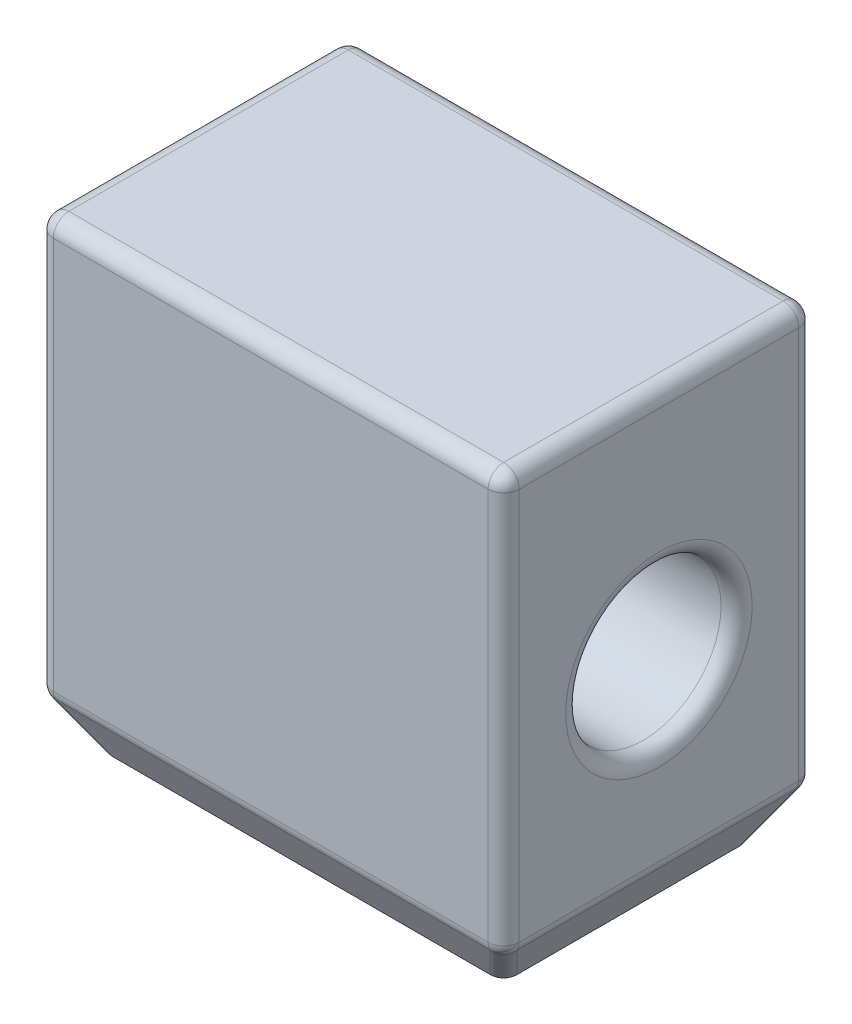
ISO-10303-21;
HEADER;
FILE_DESCRIPTION(('STEP AP214'),'2;1');
FILE_NAME('part.step','',(''),(''),'','','');
FILE_SCHEMA(('AUTOMOTIVE_DESIGN { 1 0 10303 214 1 1 1 1 }'));
ENDSEC;
DATA;
#1=APPLICATION_CONTEXT('core data for automotive mechanical design processes');
#2=APPLICATION_PROTOCOL_DEFINITION('international standard','automotive_design',2000,#1);
#3=PRODUCT_CONTEXT('',#1,'mechanical');
#4=PRODUCT('Part','Part','',(#3));
#5=PRODUCT_RELATED_PRODUCT_CATEGORY('part','',(#4));
#6=PRODUCT_DEFINITION_FORMATION('','',#4);
#7=PRODUCT_DEFINITION_CONTEXT('part definition',#1,'design');
#8=PRODUCT_DEFINITION('design','',#6,#7);
#9=PRODUCT_DEFINITION_SHAPE('','',#8);
#10=(LENGTH_UNIT() NAMED_UNIT(*) SI_UNIT(.MILLI.,.METRE.));
#11=(NAMED_UNIT(*) PLANE_ANGLE_UNIT() SI_UNIT($,.RADIAN.));
#12=(NAMED_UNIT(*) SI_UNIT($,.STERADIAN.) SOLID_ANGLE_UNIT());
#13=UNCERTAINTY_MEASURE_WITH_UNIT(LENGTH_MEASURE(1.E-05),#10,'distance_accuracy_value','');
#14=(GEOMETRIC_REPRESENTATION_CONTEXT(3) GLOBAL_UNCERTAINTY_ASSIGNED_CONTEXT((#13)) GLOBAL_UNIT_ASSIGNED_CONTEXT((#10,
#11,#12)) REPRESENTATION_CONTEXT('',''));
#15=CARTESIAN_POINT('',(0.,0.,0.));
#16=DIRECTION('',(0.,0.,1.));
#17=DIRECTION('',(1.,0.,0.));
#18=AXIS2_PLACEMENT_3D('',#15,#16,#17);
#19=CARTESIAN_POINT('',(150.,150.,-100.));
#20=DIRECTION('',(-1.,0.,0.));
#21=DIRECTION('',(0.,0.,1.));
#22=AXIS2_PLACEMENT_3D('',#19,#20,#21);
#23=PLANE('',#22);
#24=CARTESIAN_POINT('',(150.,75.,-50.));
#25=DIRECTION('',(-1.,0.,0.));
#26=DIRECTION('',(0.,0.,1.));
#27=AXIS2_PLACEMENT_3D('',#24,#25,#26);
#28=CIRCLE('',#27,30.);
#29=CARTESIAN_POINT('',(150.,75.,-20.));
#30=VERTEX_POINT('',#29);
#31=EDGE_CURVE('E237',#30,#30,#28,.T.);
#32=ORIENTED_EDGE('',*,*,#31,.T.);
#33=EDGE_LOOP('',(#32));
#34=FACE_BOUND('',#33,.T.);
#35=DIRECTION('',(0.,0.,1.));
#36=VECTOR('',#35,1.);
#37=CARTESIAN_POINT('',(150.,18.6602540378444,-100.));
#38=LINE('',#37,#36);
#39=CARTESIAN_POINT('',(150.,18.6602540378444,-5.));
#40=VERTEX_POINT('',#39);
#41=CARTESIAN_POINT('',(150.,18.6602540378444,-95.));
#42=VERTEX_POINT('',#41);
#43=EDGE_CURVE('E243',#40,#42,#38,.F.);
#44=ORIENTED_EDGE('',*,*,#43,.T.);
#45=DIRECTION('',(0.,-1.,0.));
#46=VECTOR('',#45,1.);
#47=CARTESIAN_POINT('',(150.,150.,-95.));
#48=LINE('',#47,#46);
#49=CARTESIAN_POINT('',(150.,145.,-95.));
#50=VERTEX_POINT('',#49);
#51=EDGE_CURVE('E246',#42,#50,#48,.F.);
#52=ORIENTED_EDGE('',*,*,#51,.T.);
#53=DIRECTION('',(0.,0.,-1.));
#54=VECTOR('',#53,1.);
#55=CARTESIAN_POINT('',(150.,145.,0.));
#56=LINE('',#55,#54);
#57=CARTESIAN_POINT('',(150.,145.,-5.00000000000001));
#58=VERTEX_POINT('',#57);
#59=EDGE_CURVE('E368',#50,#58,#56,.F.);
#60=ORIENTED_EDGE('',*,*,#59,.T.);
#61=DIRECTION('',(0.,-1.,0.));
#62=VECTOR('',#61,1.);
#63=CARTESIAN_POINT('',(150.,150.,-5.));
#64=LINE('',#63,#62);
#65=EDGE_CURVE('E240',#58,#40,#64,.T.);
#66=ORIENTED_EDGE('',*,*,#65,.T.);
#67=EDGE_LOOP('',(#44,#52,#60,#66));
#68=FACE_BOUND('',#67,.T.);
#69=ADVANCED_FACE('F41',(#34,#68),#23,.F.);
#70=CARTESIAN_POINT('',(0.,150.,-100.));
#71=DIRECTION('',(0.,0.,1.));
#72=DIRECTION('',(1.,0.,0.));
#73=AXIS2_PLACEMENT_3D('',#70,#71,#72);
#74=PLANE('',#73);
#75=DIRECTION('',(0.,-1.,0.));
#76=VECTOR('',#75,1.);
#77=CARTESIAN_POINT('',(145.,150.,-100.));
#78=LINE('',#77,#76);
#79=CARTESIAN_POINT('',(145.,145.,-100.));
#80=VERTEX_POINT('',#79);
#81=CARTESIAN_POINT('',(145.,18.6602540378444,-100.));
#82=VERTEX_POINT('',#81);
#83=EDGE_CURVE('E385',#80,#82,#78,.T.);
#84=ORIENTED_EDGE('',*,*,#83,.T.);
#85=DIRECTION('',(1.,0.,0.));
#86=VECTOR('',#85,1.);
#87=CARTESIAN_POINT('',(4.99999999999999,18.6602540378444,-100.));
#88=LINE('',#87,#86);
#89=CARTESIAN_POINT('',(4.99999999999999,18.6602540378444,-100.));
#90=VERTEX_POINT('',#89);
#91=EDGE_CURVE('E285',#82,#90,#88,.F.);
#92=ORIENTED_EDGE('',*,*,#91,.T.);
#93=DIRECTION('',(0.,-1.,0.));
#94=VECTOR('',#93,1.);
#95=CARTESIAN_POINT('',(4.99999999999999,150.,-100.));
#96=LINE('',#95,#94);
#97=CARTESIAN_POINT('',(4.99999999999999,145.,-100.));
#98=VERTEX_POINT('',#97);
#99=EDGE_CURVE('E204',#90,#98,#96,.F.);
#100=ORIENTED_EDGE('',*,*,#99,.T.);
#101=DIRECTION('',(-1.,0.,0.));
#102=VECTOR('',#101,1.);
#103=CARTESIAN_POINT('',(145.,145.,-100.));
#104=LINE('',#103,#102);
#105=EDGE_CURVE('E208',#98,#80,#104,.F.);
#106=ORIENTED_EDGE('',*,*,#105,.T.);
#107=EDGE_LOOP('',(#84,#92,#100,#106));
#108=FACE_BOUND('',#107,.T.);
#109=ADVANCED_FACE('F390',(#108),#74,.F.);
#110=CARTESIAN_POINT('',(0.,150.,-100.));
#111=DIRECTION('',(1.,0.,0.));
#112=DIRECTION('',(0.,0.,-1.));
#113=AXIS2_PLACEMENT_3D('',#110,#111,#112);
#114=PLANE('',#113);
#115=CARTESIAN_POINT('',(0.,75.,-50.));
#116=DIRECTION('',(1.,0.,0.));
#117=DIRECTION('',(0.,0.,-1.));
#118=AXIS2_PLACEMENT_3D('',#115,#116,#117);
#119=CIRCLE('',#118,30.);
#120=CARTESIAN_POINT('',(0.,75.,-80.));
#121=VERTEX_POINT('',#120);
#122=EDGE_CURVE('E217',#121,#121,#119,.T.);
#123=ORIENTED_EDGE('',*,*,#122,.T.);
#124=EDGE_LOOP('',(#123));
#125=FACE_BOUND('',#124,.T.);
#126=DIRECTION('',(0.,0.,-1.));
#127=VECTOR('',#126,1.);
#128=CARTESIAN_POINT('',(0.,18.6602540378444,0.));
#129=LINE('',#128,#127);
#130=CARTESIAN_POINT('',(0.,18.6602540378444,-95.));
#131=VERTEX_POINT('',#130);
#132=CARTESIAN_POINT('',(0.,18.6602540378444,-5.));
#133=VERTEX_POINT('',#132);
#134=EDGE_CURVE('E223',#131,#133,#129,.F.);
#135=ORIENTED_EDGE('',*,*,#134,.T.);
#136=DIRECTION('',(0.,-1.,0.));
#137=VECTOR('',#136,1.);
#138=CARTESIAN_POINT('',(0.,150.,-5.));
#139=LINE('',#138,#137);
#140=CARTESIAN_POINT('',(0.,145.,-5.));
#141=VERTEX_POINT('',#140);
#142=EDGE_CURVE('E226',#133,#141,#139,.F.);
#143=ORIENTED_EDGE('',*,*,#142,.T.);
#144=DIRECTION('',(0.,0.,1.));
#145=VECTOR('',#144,1.);
#146=CARTESIAN_POINT('',(0.,145.,-100.));
#147=LINE('',#146,#145);
#148=CARTESIAN_POINT('',(0.,145.,-95.));
#149=VERTEX_POINT('',#148);
#150=EDGE_CURVE('E410',#141,#149,#147,.F.);
#151=ORIENTED_EDGE('',*,*,#150,.T.);
#152=DIRECTION('',(0.,-1.,0.));
#153=VECTOR('',#152,1.);
#154=CARTESIAN_POINT('',(0.,150.,-95.));
#155=LINE('',#154,#153);
#156=EDGE_CURVE('E220',#149,#131,#155,.T.);
#157=ORIENTED_EDGE('',*,*,#156,.T.);
#158=EDGE_LOOP('',(#135,#143,#151,#157));
#159=FACE_BOUND('',#158,.T.);
#160=ADVANCED_FACE('F437',(#125,#159),#114,.F.);
#161=CARTESIAN_POINT('',(0.,150.,0.));
#162=DIRECTION('',(0.,0.,-1.));
#163=DIRECTION('',(-1.,0.,0.));
#164=AXIS2_PLACEMENT_3D('',#161,#162,#163);
#165=PLANE('',#164);
#166=DIRECTION('',(0.,-1.,0.));
#167=VECTOR('',#166,1.);
#168=CARTESIAN_POINT('',(5.,150.,0.));
#169=LINE('',#168,#167);
#170=CARTESIAN_POINT('',(5.,145.,0.));
#171=VERTEX_POINT('',#170);
#172=CARTESIAN_POINT('',(5.,18.6602540378444,0.));
#173=VERTEX_POINT('',#172);
#174=EDGE_CURVE('E213',#171,#173,#169,.T.);
#175=ORIENTED_EDGE('',*,*,#174,.T.);
#176=DIRECTION('',(-1.,0.,0.));
#177=VECTOR('',#176,1.);
#178=CARTESIAN_POINT('',(145.,18.6602540378444,0.));
#179=LINE('',#178,#177);
#180=CARTESIAN_POINT('',(145.,18.6602540378444,0.));
#181=VERTEX_POINT('',#180);
#182=EDGE_CURVE('E58',#173,#181,#179,.F.);
#183=ORIENTED_EDGE('',*,*,#182,.T.);
#184=DIRECTION('',(0.,-1.,0.));
#185=VECTOR('',#184,1.);
#186=CARTESIAN_POINT('',(145.,150.,0.));
#187=LINE('',#186,#185);
#188=CARTESIAN_POINT('',(145.,145.,0.));
#189=VERTEX_POINT('',#188);
#190=EDGE_CURVE('E206',#181,#189,#187,.F.);
#191=ORIENTED_EDGE('',*,*,#190,.T.);
#192=DIRECTION('',(1.,0.,0.));
#193=VECTOR('',#192,1.);
#194=CARTESIAN_POINT('',(0.,145.,0.));
#195=LINE('',#194,#193);
#196=EDGE_CURVE('E175',#189,#171,#195,.F.);
#197=ORIENTED_EDGE('',*,*,#196,.T.);
#198=EDGE_LOOP('',(#175,#183,#191,#197));
#199=FACE_BOUND('',#198,.T.);
#200=ADVANCED_FACE('F413',(#199),#165,.F.);
#201=CARTESIAN_POINT('',(0.,150.,0.));
#202=DIRECTION('',(0.,1.,0.));
#203=DIRECTION('',(0.,0.,1.));
#204=AXIS2_PLACEMENT_3D('',#201,#202,#203);
#205=PLANE('',#204);
#206=DIRECTION('',(0.,0.,-1.));
#207=VECTOR('',#206,1.);
#208=CARTESIAN_POINT('',(145.,150.,-100.));
#209=LINE('',#208,#207);
#210=CARTESIAN_POINT('',(145.,150.,-5.));
#211=VERTEX_POINT('',#210);
#212=CARTESIAN_POINT('',(145.,150.,-95.));
#213=VERTEX_POINT('',#212);
#214=EDGE_CURVE('E188',#211,#213,#209,.T.);
#215=ORIENTED_EDGE('',*,*,#214,.T.);
#216=DIRECTION('',(-1.,0.,0.));
#217=VECTOR('',#216,1.);
#218=CARTESIAN_POINT('',(4.99999999999999,150.,-95.));
#219=LINE('',#218,#217);
#220=CARTESIAN_POINT('',(4.99999999999999,150.,-95.));
#221=VERTEX_POINT('',#220);
#222=EDGE_CURVE('E383',#213,#221,#219,.T.);
#223=ORIENTED_EDGE('',*,*,#222,.T.);
#224=DIRECTION('',(0.,0.,1.));
#225=VECTOR('',#224,1.);
#226=CARTESIAN_POINT('',(5.,150.,0.));
#227=LINE('',#226,#225);
#228=CARTESIAN_POINT('',(5.,150.,-5.));
#229=VERTEX_POINT('',#228);
#230=EDGE_CURVE('E191',#221,#229,#227,.T.);
#231=ORIENTED_EDGE('',*,*,#230,.T.);
#232=DIRECTION('',(1.,0.,0.));
#233=VECTOR('',#232,1.);
#234=CARTESIAN_POINT('',(150.,150.,-5.));
#235=LINE('',#234,#233);
#236=EDGE_CURVE('E173',#229,#211,#235,.T.);
#237=ORIENTED_EDGE('',*,*,#236,.T.);
#238=EDGE_LOOP('',(#215,#223,#231,#237));
#239=FACE_BOUND('',#238,.T.);
#240=ADVANCED_FACE('F187',(#239),#205,.T.);
#241=CARTESIAN_POINT('',(0.,0.,0.));
#242=DIRECTION('',(0.,1.,0.));
#243=DIRECTION('',(0.,0.,1.));
#244=AXIS2_PLACEMENT_3D('',#241,#242,#243);
#245=PLANE('',#244);
#246=DIRECTION('',(-1.,0.,0.));
#247=VECTOR('',#246,1.);
#248=CARTESIAN_POINT('',(0.,0.,-10.));
#249=LINE('',#248,#247);
#250=CARTESIAN_POINT('',(135.669872981078,0.,-10.));
#251=VERTEX_POINT('',#250);
#252=CARTESIAN_POINT('',(14.3301270189222,0.,-10.));
#253=VERTEX_POINT('',#252);
#254=EDGE_CURVE('E376',#251,#253,#249,.T.);
#255=ORIENTED_EDGE('',*,*,#254,.T.);
#256=CARTESIAN_POINT('',(15.7735026918963,0.,-15.7735026918963));
#257=DIRECTION('',(0.,1.,0.));
#258=DIRECTION('',(0.707106781186547,0.,-0.707106781186548));
#259=AXIS2_PLACEMENT_3D('',#256,#257,#258);
#260=ELLIPSE('',#259,6.45497224367903,5.);
#261=CARTESIAN_POINT('',(10.,0.,-14.3301270189222));
#262=VERTEX_POINT('',#261);
#263=EDGE_CURVE('E318',#253,#262,#260,.F.);
#264=ORIENTED_EDGE('',*,*,#263,.T.);
#265=DIRECTION('',(0.,0.,-1.));
#266=VECTOR('',#265,1.);
#267=CARTESIAN_POINT('',(10.,0.,0.));
#268=LINE('',#267,#266);
#269=CARTESIAN_POINT('',(10.,0.,-85.6698729810778));
#270=VERTEX_POINT('',#269);
#271=EDGE_CURVE('E370',#262,#270,#268,.T.);
#272=ORIENTED_EDGE('',*,*,#271,.T.);
#273=CARTESIAN_POINT('',(15.7735026918963,0.,-84.2264973081037));
#274=DIRECTION('',(0.,1.,0.));
#275=DIRECTION('',(0.707106781186548,0.,0.707106781186547));
#276=AXIS2_PLACEMENT_3D('',#273,#274,#275);
#277=ELLIPSE('',#276,6.45497224367903,5.);
#278=CARTESIAN_POINT('',(14.3301270189222,0.,-90.));
#279=VERTEX_POINT('',#278);
#280=EDGE_CURVE('E272',#270,#279,#277,.F.);
#281=ORIENTED_EDGE('',*,*,#280,.T.);
#282=DIRECTION('',(1.,0.,0.));
#283=VECTOR('',#282,1.);
#284=CARTESIAN_POINT('',(0.,0.,-90.));
#285=LINE('',#284,#283);
#286=CARTESIAN_POINT('',(135.669872981078,0.,-90.));
#287=VERTEX_POINT('',#286);
#288=EDGE_CURVE('E367',#279,#287,#285,.T.);
#289=ORIENTED_EDGE('',*,*,#288,.T.);
#290=CARTESIAN_POINT('',(134.226497308104,0.,-84.2264973081037));
#291=DIRECTION('',(0.,1.,0.));
#292=DIRECTION('',(-0.707106781186546,0.,0.707106781186549));
#293=AXIS2_PLACEMENT_3D('',#290,#291,#292);
#294=ELLIPSE('',#293,6.45497224367903,5.);
#295=CARTESIAN_POINT('',(140.,0.,-85.6698729810778));
#296=VERTEX_POINT('',#295);
#297=EDGE_CURVE('E274',#287,#296,#294,.F.);
#298=ORIENTED_EDGE('',*,*,#297,.T.);
#299=DIRECTION('',(0.,0.,1.));
#300=VECTOR('',#299,1.);
#301=CARTESIAN_POINT('',(140.,0.,0.));
#302=LINE('',#301,#300);
#303=CARTESIAN_POINT('',(140.,0.,-14.3301270189222));
#304=VERTEX_POINT('',#303);
#305=EDGE_CURVE('E359',#296,#304,#302,.T.);
#306=ORIENTED_EDGE('',*,*,#305,.T.);
#307=CARTESIAN_POINT('',(134.226497308104,0.,-15.7735026918963));
#308=DIRECTION('',(0.,1.,0.));
#309=DIRECTION('',(-0.707106781186547,0.,-0.707106781186548));
#310=AXIS2_PLACEMENT_3D('',#307,#308,#309);
#311=ELLIPSE('',#310,6.45497224367903,5.);
#312=EDGE_CURVE('E316',#304,#251,#311,.F.);
#313=ORIENTED_EDGE('',*,*,#312,.T.);
#314=EDGE_LOOP('',(#255,#264,#272,#281,#289,#298,#306,#313));
#315=FACE_BOUND('',#314,.T.);
#316=ADVANCED_FACE('F364',(#315),#245,.F.);
#317=CARTESIAN_POINT('',(150.,75.,-50.));
#318=DIRECTION('',(-1.,0.,0.));
#319=DIRECTION('',(0.,0.,1.));
#320=AXIS2_PLACEMENT_3D('',#317,#318,#319);
#321=CYLINDRICAL_SURFACE('',#320,25.);
#322=CARTESIAN_POINT('',(4.99999999999998,75.,-50.));
#323=DIRECTION('',(1.,0.,0.));
#324=DIRECTION('',(0.,0.,-1.));
#325=AXIS2_PLACEMENT_3D('',#322,#323,#324);
#326=CIRCLE('',#325,25.);
#327=CARTESIAN_POINT('',(4.99999999999997,75.,-75.));
#328=VERTEX_POINT('',#327);
#329=EDGE_CURVE('E231',#328,#328,#326,.F.);
#330=ORIENTED_EDGE('',*,*,#329,.T.);
#331=EDGE_LOOP('',(#330));
#332=FACE_BOUND('',#331,.T.);
#333=CARTESIAN_POINT('',(145.,75.,-50.));
#334=DIRECTION('',(-1.,0.,0.));
#335=DIRECTION('',(0.,0.,1.));
#336=AXIS2_PLACEMENT_3D('',#333,#334,#335);
#337=CIRCLE('',#336,25.);
#338=CARTESIAN_POINT('',(145.,75.,-25.));
#339=VERTEX_POINT('',#338);
#340=EDGE_CURVE('E228',#339,#339,#337,.F.);
#341=ORIENTED_EDGE('',*,*,#340,.T.);
#342=EDGE_LOOP('',(#341));
#343=FACE_BOUND('',#342,.T.);
#344=ADVANCED_FACE('F449',(#332,#343),#321,.F.);
#345=CARTESIAN_POINT('',(145.,145.,0.));
#346=DIRECTION('',(0.,0.,1.));
#347=DIRECTION('',(1.,0.,0.));
#348=AXIS2_PLACEMENT_3D('',#345,#346,#347);
#349=CYLINDRICAL_SURFACE('',#348,5.);
#350=ORIENTED_EDGE('',*,*,#59,.F.);
#351=CARTESIAN_POINT('',(145.,145.,-95.));
#352=DIRECTION('',(0.,0.,1.));
#353=DIRECTION('',(1.,0.,0.));
#354=AXIS2_PLACEMENT_3D('',#351,#352,#353);
#355=CIRCLE('',#354,5.);
#356=EDGE_CURVE('E199',#50,#213,#355,.T.);
#357=ORIENTED_EDGE('',*,*,#356,.T.);
#358=ORIENTED_EDGE('',*,*,#214,.F.);
#359=CARTESIAN_POINT('',(145.,145.,-5.));
#360=DIRECTION('',(0.,0.,1.));
#361=DIRECTION('',(1.,0.,0.));
#362=AXIS2_PLACEMENT_3D('',#359,#360,#361);
#363=CIRCLE('',#362,5.);
#364=EDGE_CURVE('E196',#211,#58,#363,.F.);
#365=ORIENTED_EDGE('',*,*,#364,.T.);
#366=EDGE_LOOP('',(#350,#357,#358,#365));
#367=FACE_BOUND('',#366,.T.);
#368=ADVANCED_FACE('F195',(#367),#349,.T.);
#369=CARTESIAN_POINT('',(0.,145.,-5.));
#370=DIRECTION('',(-1.,0.,0.));
#371=DIRECTION('',(0.,0.,1.));
#372=AXIS2_PLACEMENT_3D('',#369,#370,#371);
#373=CYLINDRICAL_SURFACE('',#372,5.);
#374=ORIENTED_EDGE('',*,*,#236,.F.);
#375=CARTESIAN_POINT('',(5.,145.,-5.));
#376=DIRECTION('',(-1.,0.,0.));
#377=DIRECTION('',(0.,0.,1.));
#378=AXIS2_PLACEMENT_3D('',#375,#376,#377);
#379=CIRCLE('',#378,5.);
#380=EDGE_CURVE('E180',#229,#171,#379,.F.);
#381=ORIENTED_EDGE('',*,*,#380,.T.);
#382=ORIENTED_EDGE('',*,*,#196,.F.);
#383=CARTESIAN_POINT('',(145.,145.,-5.));
#384=DIRECTION('',(-1.,0.,0.));
#385=DIRECTION('',(0.,0.,1.));
#386=AXIS2_PLACEMENT_3D('',#383,#384,#385);
#387=CIRCLE('',#386,5.);
#388=EDGE_CURVE('E170',#189,#211,#387,.T.);
#389=ORIENTED_EDGE('',*,*,#388,.T.);
#390=EDGE_LOOP('',(#374,#381,#382,#389));
#391=FACE_BOUND('',#390,.T.);
#392=ADVANCED_FACE('F172',(#391),#373,.T.);
#393=CARTESIAN_POINT('',(5.,145.,0.));
#394=DIRECTION('',(0.,0.,-1.));
#395=DIRECTION('',(-1.,0.,0.));
#396=AXIS2_PLACEMENT_3D('',#393,#394,#395);
#397=CYLINDRICAL_SURFACE('',#396,5.);
#398=ORIENTED_EDGE('',*,*,#150,.F.);
#399=CARTESIAN_POINT('',(5.,145.,-5.));
#400=DIRECTION('',(0.,0.,-1.));
#401=DIRECTION('',(-1.,0.,0.));
#402=AXIS2_PLACEMENT_3D('',#399,#400,#401);
#403=CIRCLE('',#402,5.);
#404=EDGE_CURVE('E181',#141,#229,#403,.T.);
#405=ORIENTED_EDGE('',*,*,#404,.T.);
#406=ORIENTED_EDGE('',*,*,#230,.F.);
#407=CARTESIAN_POINT('',(4.99999999999999,145.,-95.));
#408=DIRECTION('',(0.,0.,-1.));
#409=DIRECTION('',(-1.,0.,0.));
#410=AXIS2_PLACEMENT_3D('',#407,#408,#409);
#411=CIRCLE('',#410,5.);
#412=EDGE_CURVE('E378',#221,#149,#411,.F.);
#413=ORIENTED_EDGE('',*,*,#412,.T.);
#414=EDGE_LOOP('',(#398,#405,#406,#413));
#415=FACE_BOUND('',#414,.T.);
#416=ADVANCED_FACE('F407',(#415),#397,.T.);
#417=CARTESIAN_POINT('',(0.,17.3205080756888,-100.));
#418=DIRECTION('',(0.,0.5,0.866025403784438));
#419=DIRECTION('',(-1.,0.,0.));
#420=AXIS2_PLACEMENT_3D('',#417,#418,#419);
#421=PLANE('',#420);
#422=DIRECTION('',(-1.,0.,0.));
#423=VECTOR('',#422,1.);
#424=CARTESIAN_POINT('',(145.,16.1602540378444,-99.3301270189222));
#425=LINE('',#424,#423);
#426=CARTESIAN_POINT('',(4.99999999999999,16.1602540378444,-99.3301270189222));
#427=VERTEX_POINT('',#426);
#428=CARTESIAN_POINT('',(145.,16.1602540378444,-99.3301270189222));
#429=VERTEX_POINT('',#428);
#430=EDGE_CURVE('E248',#427,#429,#425,.F.);
#431=ORIENTED_EDGE('',*,*,#430,.T.);
#432=DIRECTION('',(0.447213595499957,0.774596669241484,-0.447213595499958));
#433=VECTOR('',#432,1.);
#434=CARTESIAN_POINT('',(116.535898384862,-33.1410161513775,-70.8660254037845));
#435=LINE('',#434,#433);
#436=EDGE_CURVE('E269',#429,#287,#435,.F.);
#437=ORIENTED_EDGE('',*,*,#436,.T.);
#438=ORIENTED_EDGE('',*,*,#288,.F.);
#439=DIRECTION('',(-0.447213595499958,0.774596669241483,-0.447213595499958));
#440=VECTOR('',#439,1.);
#441=CARTESIAN_POINT('',(3.46410161513774,18.8205080756888,-100.866025403784));
#442=LINE('',#441,#440);
#443=EDGE_CURVE('E267',#279,#427,#442,.T.);
#444=ORIENTED_EDGE('',*,*,#443,.T.);
#445=EDGE_LOOP('',(#431,#437,#438,#444));
#446=FACE_BOUND('',#445,.T.);
#447=ADVANCED_FACE('F444',(#446),#421,.F.);
#448=CARTESIAN_POINT('',(0.,17.3205080756888,-100.));
#449=DIRECTION('',(0.866025403784438,0.5,0.));
#450=DIRECTION('',(0.,0.,1.));
#451=AXIS2_PLACEMENT_3D('',#448,#449,#450);
#452=PLANE('',#451);
#453=ORIENTED_EDGE('',*,*,#271,.F.);
#454=DIRECTION('',(-0.447213595499958,0.774596669241483,0.447213595499958));
#455=VECTOR('',#454,1.);
#456=CARTESIAN_POINT('',(19.1339745962156,-15.8205080756888,-23.4641016151378));
#457=LINE('',#456,#455);
#458=CARTESIAN_POINT('',(0.66987298107781,16.1602540378444,-5.));
#459=VERTEX_POINT('',#458);
#460=EDGE_CURVE('E320',#262,#459,#457,.T.);
#461=ORIENTED_EDGE('',*,*,#460,.T.);
#462=DIRECTION('',(0.,0.,1.));
#463=VECTOR('',#462,1.);
#464=CARTESIAN_POINT('',(0.669872981077799,16.1602540378444,-100.));
#465=LINE('',#464,#463);
#466=CARTESIAN_POINT('',(0.669872981077799,16.1602540378444,-95.));
#467=VERTEX_POINT('',#466);
#468=EDGE_CURVE('E215',#459,#467,#465,.F.);
#469=ORIENTED_EDGE('',*,*,#468,.T.);
#470=DIRECTION('',(-0.447213595499958,0.774596669241483,-0.447213595499958));
#471=VECTOR('',#470,1.);
#472=CARTESIAN_POINT('',(-0.866025403784449,18.8205080756888,-96.5358983848623));
#473=LINE('',#472,#471);
#474=EDGE_CURVE('E278',#467,#270,#473,.F.);
#475=ORIENTED_EDGE('',*,*,#474,.T.);
#476=EDGE_LOOP('',(#453,#461,#469,#475));
#477=FACE_BOUND('',#476,.T.);
#478=ADVANCED_FACE('F463',(#477),#452,.F.);
#479=CARTESIAN_POINT('',(150.,17.3205080756888,-100.));
#480=DIRECTION('',(-0.866025403784439,0.499999999999999,0.));
#481=DIRECTION('',(0.,0.,-1.));
#482=AXIS2_PLACEMENT_3D('',#479,#480,#481);
#483=PLANE('',#482);
#484=DIRECTION('',(0.,0.,-1.));
#485=VECTOR('',#484,1.);
#486=CARTESIAN_POINT('',(149.330127018922,16.1602540378444,0.));
#487=LINE('',#486,#485);
#488=CARTESIAN_POINT('',(149.330127018922,16.1602540378444,-95.));
#489=VERTEX_POINT('',#488);
#490=CARTESIAN_POINT('',(149.330127018922,16.1602540378444,-5.));
#491=VERTEX_POINT('',#490);
#492=EDGE_CURVE('E234',#489,#491,#487,.F.);
#493=ORIENTED_EDGE('',*,*,#492,.T.);
#494=DIRECTION('',(0.447213595499957,0.774596669241484,0.447213595499958));
#495=VECTOR('',#494,1.);
#496=CARTESIAN_POINT('',(130.866025403784,-15.8205080756888,-23.4641016151378));
#497=LINE('',#496,#495);
#498=EDGE_CURVE('E322',#491,#304,#497,.F.);
#499=ORIENTED_EDGE('',*,*,#498,.T.);
#500=ORIENTED_EDGE('',*,*,#305,.F.);
#501=DIRECTION('',(0.447213595499957,0.774596669241484,-0.447213595499958));
#502=VECTOR('',#501,1.);
#503=CARTESIAN_POINT('',(150.866025403784,18.8205080756888,-96.5358983848623));
#504=LINE('',#503,#502);
#505=EDGE_CURVE('E276',#296,#489,#504,.T.);
#506=ORIENTED_EDGE('',*,*,#505,.T.);
#507=EDGE_LOOP('',(#493,#499,#500,#506));
#508=FACE_BOUND('',#507,.T.);
#509=ADVANCED_FACE('F358',(#508),#483,.F.);
#510=CARTESIAN_POINT('',(0.,17.3205080756888,0.));
#511=DIRECTION('',(0.,0.5,-0.866025403784438));
#512=DIRECTION('',(1.,0.,0.));
#513=AXIS2_PLACEMENT_3D('',#510,#511,#512);
#514=PLANE('',#513);
#515=DIRECTION('',(1.,0.,0.));
#516=VECTOR('',#515,1.);
#517=CARTESIAN_POINT('',(5.,16.1602540378444,-0.669872981077811));
#518=LINE('',#517,#516);
#519=CARTESIAN_POINT('',(145.,16.1602540378444,-0.669872981077811));
#520=VERTEX_POINT('',#519);
#521=CARTESIAN_POINT('',(5.,16.1602540378444,-0.669872981077811));
#522=VERTEX_POINT('',#521);
#523=EDGE_CURVE('E292',#520,#522,#518,.F.);
#524=ORIENTED_EDGE('',*,*,#523,.T.);
#525=DIRECTION('',(-0.447213595499958,0.774596669241483,0.447213595499958));
#526=VECTOR('',#525,1.);
#527=CARTESIAN_POINT('',(3.46410161513775,18.8205080756888,0.866025403784439));
#528=LINE('',#527,#526);
#529=EDGE_CURVE('E313',#522,#253,#528,.F.);
#530=ORIENTED_EDGE('',*,*,#529,.T.);
#531=ORIENTED_EDGE('',*,*,#254,.F.);
#532=DIRECTION('',(0.447213595499957,0.774596669241484,0.447213595499958));
#533=VECTOR('',#532,1.);
#534=CARTESIAN_POINT('',(116.535898384862,-33.1410161513775,-29.1339745962156));
#535=LINE('',#534,#533);
#536=EDGE_CURVE('E311',#251,#520,#535,.T.);
#537=ORIENTED_EDGE('',*,*,#536,.T.);
#538=EDGE_LOOP('',(#524,#530,#531,#537));
#539=FACE_BOUND('',#538,.T.);
#540=ADVANCED_FACE('F451',(#539),#514,.F.);
#541=CARTESIAN_POINT('',(145.,145.,-5.));
#542=DIRECTION('',(0.,0.,1.));
#543=DIRECTION('',(1.,0.,0.));
#544=AXIS2_PLACEMENT_3D('',#541,#542,#543);
#545=SPHERICAL_SURFACE('',#544,5.);
#546=ORIENTED_EDGE('',*,*,#364,.F.);
#547=ORIENTED_EDGE('',*,*,#388,.F.);
#548=CARTESIAN_POINT('',(145.,145.,-5.));
#549=DIRECTION('',(0.,-1.,0.));
#550=DIRECTION('',(0.,0.,-1.));
#551=AXIS2_PLACEMENT_3D('',#548,#549,#550);
#552=CIRCLE('',#551,5.);
#553=EDGE_CURVE('E200',#58,#189,#552,.T.);
#554=ORIENTED_EDGE('',*,*,#553,.F.);
#555=EDGE_LOOP('',(#546,#547,#554));
#556=FACE_BOUND('',#555,.T.);
#557=ADVANCED_FACE('F202',(#556),#545,.T.);
#558=CARTESIAN_POINT('',(145.,150.,-5.));
#559=DIRECTION('',(0.,-1.,0.));
#560=DIRECTION('',(0.,0.,-1.));
#561=AXIS2_PLACEMENT_3D('',#558,#559,#560);
#562=CYLINDRICAL_SURFACE('',#561,5.);
#563=ORIENTED_EDGE('',*,*,#190,.F.);
#564=CARTESIAN_POINT('',(145.,18.6602540378444,-5.));
#565=DIRECTION('',(0.,-1.,0.));
#566=DIRECTION('',(0.,0.,-1.));
#567=AXIS2_PLACEMENT_3D('',#564,#565,#566);
#568=CIRCLE('',#567,5.);
#569=EDGE_CURVE('E50',#181,#40,#568,.F.);
#570=ORIENTED_EDGE('',*,*,#569,.T.);
#571=ORIENTED_EDGE('',*,*,#65,.F.);
#572=ORIENTED_EDGE('',*,*,#553,.T.);
#573=EDGE_LOOP('',(#563,#570,#571,#572));
#574=FACE_BOUND('',#573,.T.);
#575=ADVANCED_FACE('F496',(#574),#562,.T.);
#576=CARTESIAN_POINT('',(145.,18.6602540378444,-100.));
#577=DIRECTION('',(0.,0.,-1.));
#578=DIRECTION('',(-1.,0.,0.));
#579=AXIS2_PLACEMENT_3D('',#576,#577,#578);
#580=CYLINDRICAL_SURFACE('',#579,5.);
#581=ORIENTED_EDGE('',*,*,#43,.F.);
#582=CARTESIAN_POINT('',(145.,18.6602540378444,-4.99999999999999));
#583=DIRECTION('',(0.,0.,-1.));
#584=DIRECTION('',(-1.,0.,0.));
#585=AXIS2_PLACEMENT_3D('',#582,#583,#584);
#586=CIRCLE('',#585,5.);
#587=EDGE_CURVE('E11',#40,#491,#586,.T.);
#588=ORIENTED_EDGE('',*,*,#587,.T.);
#589=ORIENTED_EDGE('',*,*,#492,.F.);
#590=CARTESIAN_POINT('',(145.,18.6602540378444,-95.));
#591=DIRECTION('',(0.,0.,-1.));
#592=DIRECTION('',(-1.,0.,0.));
#593=AXIS2_PLACEMENT_3D('',#590,#591,#592);
#594=CIRCLE('',#593,5.);
#595=EDGE_CURVE('E281',#489,#42,#594,.F.);
#596=ORIENTED_EDGE('',*,*,#595,.T.);
#597=EDGE_LOOP('',(#581,#588,#589,#596));
#598=FACE_BOUND('',#597,.T.);
#599=ADVANCED_FACE('F494',(#598),#580,.T.);
#600=CARTESIAN_POINT('',(145.,150.,-95.));
#601=DIRECTION('',(0.,-1.,0.));
#602=DIRECTION('',(0.,0.,-1.));
#603=AXIS2_PLACEMENT_3D('',#600,#601,#602);
#604=CYLINDRICAL_SURFACE('',#603,5.);
#605=ORIENTED_EDGE('',*,*,#51,.F.);
#606=CARTESIAN_POINT('',(145.,18.6602540378444,-95.));
#607=DIRECTION('',(0.,-1.,0.));
#608=DIRECTION('',(0.,0.,-1.));
#609=AXIS2_PLACEMENT_3D('',#606,#607,#608);
#610=CIRCLE('',#609,5.);
#611=EDGE_CURVE('E283',#42,#82,#610,.F.);
#612=ORIENTED_EDGE('',*,*,#611,.T.);
#613=ORIENTED_EDGE('',*,*,#83,.F.);
#614=CARTESIAN_POINT('',(145.,145.,-95.));
#615=DIRECTION('',(0.,1.,0.));
#616=DIRECTION('',(0.,0.,1.));
#617=AXIS2_PLACEMENT_3D('',#614,#615,#616);
#618=CIRCLE('',#617,5.);
#619=EDGE_CURVE('E262',#50,#80,#618,.T.);
#620=ORIENTED_EDGE('',*,*,#619,.F.);
#621=EDGE_LOOP('',(#605,#612,#613,#620));
#622=FACE_BOUND('',#621,.T.);
#623=ADVANCED_FACE('F398',(#622),#604,.T.);
#624=CARTESIAN_POINT('',(145.,145.,-95.));
#625=DIRECTION('',(0.,0.,1.));
#626=DIRECTION('',(1.,0.,0.));
#627=AXIS2_PLACEMENT_3D('',#624,#625,#626);
#628=SPHERICAL_SURFACE('',#627,5.);
#629=ORIENTED_EDGE('',*,*,#356,.F.);
#630=ORIENTED_EDGE('',*,*,#619,.T.);
#631=CARTESIAN_POINT('',(145.,145.,-95.));
#632=DIRECTION('',(-1.,0.,0.));
#633=DIRECTION('',(0.,0.,1.));
#634=AXIS2_PLACEMENT_3D('',#631,#632,#633);
#635=CIRCLE('',#634,5.);
#636=EDGE_CURVE('E259',#213,#80,#635,.T.);
#637=ORIENTED_EDGE('',*,*,#636,.F.);
#638=EDGE_LOOP('',(#629,#630,#637));
#639=FACE_BOUND('',#638,.T.);
#640=ADVANCED_FACE('F401',(#639),#628,.T.);
#641=CARTESIAN_POINT('',(0.,145.,-95.));
#642=DIRECTION('',(1.,0.,0.));
#643=DIRECTION('',(0.,0.,-1.));
#644=AXIS2_PLACEMENT_3D('',#641,#642,#643);
#645=CYLINDRICAL_SURFACE('',#644,5.);
#646=CARTESIAN_POINT('',(4.99999999999999,145.,-95.));
#647=DIRECTION('',(-1.,0.,0.));
#648=DIRECTION('',(0.,0.,1.));
#649=AXIS2_PLACEMENT_3D('',#646,#647,#648);
#650=CIRCLE('',#649,5.);
#651=EDGE_CURVE('E256',#221,#98,#650,.T.);
#652=ORIENTED_EDGE('',*,*,#651,.F.);
#653=ORIENTED_EDGE('',*,*,#222,.F.);
#654=ORIENTED_EDGE('',*,*,#636,.T.);
#655=ORIENTED_EDGE('',*,*,#105,.F.);
#656=EDGE_LOOP('',(#652,#653,#654,#655));
#657=FACE_BOUND('',#656,.T.);
#658=ADVANCED_FACE('F403',(#657),#645,.T.);
#659=CARTESIAN_POINT('',(4.99999999999999,145.,-95.));
#660=DIRECTION('',(0.,0.,1.));
#661=DIRECTION('',(1.,0.,0.));
#662=AXIS2_PLACEMENT_3D('',#659,#660,#661);
#663=SPHERICAL_SURFACE('',#662,5.);
#664=ORIENTED_EDGE('',*,*,#412,.F.);
#665=ORIENTED_EDGE('',*,*,#651,.T.);
#666=CARTESIAN_POINT('',(4.99999999999999,145.,-95.));
#667=DIRECTION('',(0.,-1.,0.));
#668=DIRECTION('',(0.,0.,-1.));
#669=AXIS2_PLACEMENT_3D('',#666,#667,#668);
#670=CIRCLE('',#669,5.);
#671=EDGE_CURVE('E252',#149,#98,#670,.T.);
#672=ORIENTED_EDGE('',*,*,#671,.F.);
#673=EDGE_LOOP('',(#664,#665,#672));
#674=FACE_BOUND('',#673,.T.);
#675=ADVANCED_FACE('F756',(#674),#663,.T.);
#676=CARTESIAN_POINT('',(4.99999999999999,150.,-95.));
#677=DIRECTION('',(0.,-1.,0.));
#678=DIRECTION('',(0.,0.,-1.));
#679=AXIS2_PLACEMENT_3D('',#676,#677,#678);
#680=CYLINDRICAL_SURFACE('',#679,5.);
#681=ORIENTED_EDGE('',*,*,#99,.F.);
#682=CARTESIAN_POINT('',(4.99999999999999,18.6602540378444,-95.));
#683=DIRECTION('',(0.,-1.,0.));
#684=DIRECTION('',(0.,0.,-1.));
#685=AXIS2_PLACEMENT_3D('',#682,#683,#684);
#686=CIRCLE('',#685,5.);
#687=EDGE_CURVE('E287',#90,#131,#686,.F.);
#688=ORIENTED_EDGE('',*,*,#687,.T.);
#689=ORIENTED_EDGE('',*,*,#156,.F.);
#690=ORIENTED_EDGE('',*,*,#671,.T.);
#691=EDGE_LOOP('',(#681,#688,#689,#690));
#692=FACE_BOUND('',#691,.T.);
#693=ADVANCED_FACE('F617',(#692),#680,.T.);
#694=CARTESIAN_POINT('',(4.99999999999999,18.6602540378444,-100.));
#695=DIRECTION('',(0.,0.,1.));
#696=DIRECTION('',(1.,0.,0.));
#697=AXIS2_PLACEMENT_3D('',#694,#695,#696);
#698=CYLINDRICAL_SURFACE('',#697,5.);
#699=ORIENTED_EDGE('',*,*,#468,.F.);
#700=CARTESIAN_POINT('',(5.,18.6602540378444,-4.99999999999999));
#701=DIRECTION('',(0.,0.,1.));
#702=DIRECTION('',(1.,0.,0.));
#703=AXIS2_PLACEMENT_3D('',#700,#701,#702);
#704=CIRCLE('',#703,5.);
#705=EDGE_CURVE('E324',#459,#133,#704,.F.);
#706=ORIENTED_EDGE('',*,*,#705,.T.);
#707=ORIENTED_EDGE('',*,*,#134,.F.);
#708=CARTESIAN_POINT('',(4.99999999999999,18.6602540378444,-95.));
#709=DIRECTION('',(0.,0.,1.));
#710=DIRECTION('',(1.,0.,0.));
#711=AXIS2_PLACEMENT_3D('',#708,#709,#710);
#712=CIRCLE('',#711,5.);
#713=EDGE_CURVE('E289',#131,#467,#712,.T.);
#714=ORIENTED_EDGE('',*,*,#713,.T.);
#715=EDGE_LOOP('',(#699,#706,#707,#714));
#716=FACE_BOUND('',#715,.T.);
#717=ADVANCED_FACE('F428',(#716),#698,.T.);
#718=CARTESIAN_POINT('',(5.,150.,-5.));
#719=DIRECTION('',(0.,-1.,0.));
#720=DIRECTION('',(0.,0.,-1.));
#721=AXIS2_PLACEMENT_3D('',#718,#719,#720);
#722=CYLINDRICAL_SURFACE('',#721,5.);
#723=ORIENTED_EDGE('',*,*,#142,.F.);
#724=CARTESIAN_POINT('',(5.,18.6602540378444,-5.));
#725=DIRECTION('',(0.,-1.,0.));
#726=DIRECTION('',(0.,0.,-1.));
#727=AXIS2_PLACEMENT_3D('',#724,#725,#726);
#728=CIRCLE('',#727,5.);
#729=EDGE_CURVE('E66',#133,#173,#728,.F.);
#730=ORIENTED_EDGE('',*,*,#729,.T.);
#731=ORIENTED_EDGE('',*,*,#174,.F.);
#732=CARTESIAN_POINT('',(5.,145.,-5.));
#733=DIRECTION('',(0.,1.,0.));
#734=DIRECTION('',(0.,0.,1.));
#735=AXIS2_PLACEMENT_3D('',#732,#733,#734);
#736=CIRCLE('',#735,5.);
#737=EDGE_CURVE('E249',#141,#171,#736,.T.);
#738=ORIENTED_EDGE('',*,*,#737,.F.);
#739=EDGE_LOOP('',(#723,#730,#731,#738));
#740=FACE_BOUND('',#739,.T.);
#741=ADVANCED_FACE('F415',(#740),#722,.T.);
#742=CARTESIAN_POINT('',(5.,145.,-5.));
#743=DIRECTION('',(0.,0.,1.));
#744=DIRECTION('',(1.,0.,0.));
#745=AXIS2_PLACEMENT_3D('',#742,#743,#744);
#746=SPHERICAL_SURFACE('',#745,5.);
#747=ORIENTED_EDGE('',*,*,#737,.T.);
#748=ORIENTED_EDGE('',*,*,#380,.F.);
#749=ORIENTED_EDGE('',*,*,#404,.F.);
#750=EDGE_LOOP('',(#747,#748,#749));
#751=FACE_BOUND('',#750,.T.);
#752=ADVANCED_FACE('F417',(#751),#746,.T.);
#753=CARTESIAN_POINT('',(4.99999999999998,75.,-50.));
#754=DIRECTION('',(1.,0.,0.));
#755=DIRECTION('',(0.,0.,-1.));
#756=AXIS2_PLACEMENT_3D('',#753,#754,#755);
#757=TOROIDAL_SURFACE('',#756,30.,5.);
#758=ORIENTED_EDGE('',*,*,#122,.F.);
#759=EDGE_LOOP('',(#758));
#760=FACE_BOUND('',#759,.T.);
#761=ORIENTED_EDGE('',*,*,#329,.F.);
#762=EDGE_LOOP('',(#761));
#763=FACE_BOUND('',#762,.T.);
#764=ADVANCED_FACE('F419',(#760,#763),#757,.T.);
#765=CARTESIAN_POINT('',(145.,75.,-50.));
#766=DIRECTION('',(-1.,0.,0.));
#767=DIRECTION('',(0.,0.,1.));
#768=AXIS2_PLACEMENT_3D('',#765,#766,#767);
#769=TOROIDAL_SURFACE('',#768,30.,5.);
#770=ORIENTED_EDGE('',*,*,#340,.F.);
#771=EDGE_LOOP('',(#770));
#772=FACE_BOUND('',#771,.T.);
#773=ORIENTED_EDGE('',*,*,#31,.F.);
#774=EDGE_LOOP('',(#773));
#775=FACE_BOUND('',#774,.T.);
#776=ADVANCED_FACE('F425',(#772,#775),#769,.T.);
#777=CARTESIAN_POINT('',(3.46410161513774,21.3205080756888,-96.5358983848623));
#778=DIRECTION('',(0.447213595499958,-0.774596669241483,0.447213595499958));
#779=DIRECTION('',(0.866025403784438,0.5,0.));
#780=AXIS2_PLACEMENT_3D('',#777,#778,#779);
#781=CYLINDRICAL_SURFACE('',#780,5.);
#782=ORIENTED_EDGE('',*,*,#280,.F.);
#783=ORIENTED_EDGE('',*,*,#474,.F.);
#784=CARTESIAN_POINT('',(4.99999999999999,18.6602540378444,-95.));
#785=DIRECTION('',(-0.447213595499958,0.774596669241483,-0.447213595499958));
#786=DIRECTION('',(-0.866025403784438,-0.5,0.));
#787=AXIS2_PLACEMENT_3D('',#784,#785,#786);
#788=CIRCLE('',#787,5.);
#789=EDGE_CURVE('E253',#427,#467,#788,.T.);
#790=ORIENTED_EDGE('',*,*,#789,.F.);
#791=ORIENTED_EDGE('',*,*,#443,.F.);
#792=EDGE_LOOP('',(#782,#783,#790,#791));
#793=FACE_BOUND('',#792,.T.);
#794=ADVANCED_FACE('F558',(#793),#781,.T.);
#795=CARTESIAN_POINT('',(4.99999999999999,18.6602540378444,-95.));
#796=DIRECTION('',(0.,-0.5,-0.866025403784438));
#797=DIRECTION('',(0.,0.866025403784438,-0.5));
#798=AXIS2_PLACEMENT_3D('',#795,#796,#797);
#799=SPHERICAL_SURFACE('',#798,5.);
#800=ORIENTED_EDGE('',*,*,#789,.T.);
#801=ORIENTED_EDGE('',*,*,#713,.F.);
#802=CARTESIAN_POINT('',(4.99999999999999,18.6602540378444,-95.));
#803=DIRECTION('',(0.,0.866025403784438,-0.500000000000001));
#804=DIRECTION('',(0.,0.500000000000001,0.866025403784438));
#805=AXIS2_PLACEMENT_3D('',#802,#803,#804);
#806=CIRCLE('',#805,5.);
#807=EDGE_CURVE('E305',#427,#131,#806,.T.);
#808=ORIENTED_EDGE('',*,*,#807,.F.);
#809=EDGE_LOOP('',(#800,#801,#808));
#810=FACE_BOUND('',#809,.T.);
#811=ADVANCED_FACE('F554',(#810),#799,.T.);
#812=CARTESIAN_POINT('',(4.99999999999999,18.6602540378444,-95.));
#813=DIRECTION('',(0.,-0.5,-0.866025403784438));
#814=DIRECTION('',(0.,0.866025403784438,-0.5));
#815=AXIS2_PLACEMENT_3D('',#812,#813,#814);
#816=SPHERICAL_SURFACE('',#815,5.);
#817=ORIENTED_EDGE('',*,*,#807,.T.);
#818=ORIENTED_EDGE('',*,*,#687,.F.);
#819=CARTESIAN_POINT('',(4.99999999999999,18.6602540378444,-95.));
#820=DIRECTION('',(1.,0.,0.));
#821=DIRECTION('',(0.,0.,-1.));
#822=AXIS2_PLACEMENT_3D('',#819,#820,#821);
#823=CIRCLE('',#822,5.);
#824=EDGE_CURVE('E302',#427,#90,#823,.T.);
#825=ORIENTED_EDGE('',*,*,#824,.F.);
#826=EDGE_LOOP('',(#817,#818,#825));
#827=FACE_BOUND('',#826,.T.);
#828=ADVANCED_FACE('F551',(#827),#816,.T.);
#829=CARTESIAN_POINT('',(0.,18.6602540378444,-95.));
#830=DIRECTION('',(-1.,0.,0.));
#831=DIRECTION('',(0.,0.,1.));
#832=AXIS2_PLACEMENT_3D('',#829,#830,#831);
#833=CYLINDRICAL_SURFACE('',#832,5.);
#834=ORIENTED_EDGE('',*,*,#824,.T.);
#835=ORIENTED_EDGE('',*,*,#91,.F.);
#836=CARTESIAN_POINT('',(145.,18.6602540378444,-95.));
#837=DIRECTION('',(1.,0.,0.));
#838=DIRECTION('',(0.,0.,-1.));
#839=AXIS2_PLACEMENT_3D('',#836,#837,#838);
#840=CIRCLE('',#839,5.);
#841=EDGE_CURVE('E299',#429,#82,#840,.T.);
#842=ORIENTED_EDGE('',*,*,#841,.F.);
#843=ORIENTED_EDGE('',*,*,#430,.F.);
#844=EDGE_LOOP('',(#834,#835,#842,#843));
#845=FACE_BOUND('',#844,.T.);
#846=ADVANCED_FACE('F483',(#845),#833,.T.);
#847=CARTESIAN_POINT('',(145.,18.6602540378444,-95.));
#848=DIRECTION('',(0.,-0.5,-0.866025403784438));
#849=DIRECTION('',(0.,0.866025403784438,-0.5));
#850=AXIS2_PLACEMENT_3D('',#847,#848,#849);
#851=SPHERICAL_SURFACE('',#850,5.);
#852=ORIENTED_EDGE('',*,*,#841,.T.);
#853=ORIENTED_EDGE('',*,*,#611,.F.);
#854=CARTESIAN_POINT('',(145.,18.6602540378444,-95.));
#855=DIRECTION('',(0.,-0.866025403784438,0.500000000000001));
#856=DIRECTION('',(0.,-0.500000000000001,-0.866025403784438));
#857=AXIS2_PLACEMENT_3D('',#854,#855,#856);
#858=CIRCLE('',#857,5.);
#859=EDGE_CURVE('E296',#429,#42,#858,.T.);
#860=ORIENTED_EDGE('',*,*,#859,.F.);
#861=EDGE_LOOP('',(#852,#853,#860));
#862=FACE_BOUND('',#861,.T.);
#863=ADVANCED_FACE('F486',(#862),#851,.T.);
#864=CARTESIAN_POINT('',(145.,18.6602540378444,-95.));
#865=DIRECTION('',(0.,-0.5,-0.866025403784438));
#866=DIRECTION('',(0.,0.866025403784438,-0.5));
#867=AXIS2_PLACEMENT_3D('',#864,#865,#866);
#868=SPHERICAL_SURFACE('',#867,5.);
#869=ORIENTED_EDGE('',*,*,#859,.T.);
#870=ORIENTED_EDGE('',*,*,#595,.F.);
#871=CARTESIAN_POINT('',(145.,18.6602540378444,-95.));
#872=DIRECTION('',(-0.447213595499959,-0.774596669241483,0.447213595499957));
#873=DIRECTION('',(0.866025403784438,-0.500000000000001,0.));
#874=AXIS2_PLACEMENT_3D('',#871,#872,#873);
#875=CIRCLE('',#874,5.);
#876=EDGE_CURVE('E293',#429,#489,#875,.T.);
#877=ORIENTED_EDGE('',*,*,#876,.F.);
#878=EDGE_LOOP('',(#869,#870,#877));
#879=FACE_BOUND('',#878,.T.);
#880=ADVANCED_FACE('F489',(#879),#868,.T.);
#881=CARTESIAN_POINT('',(116.535898384862,-30.6410161513775,-66.5358983848623));
#882=DIRECTION('',(-0.447213595499957,-0.774596669241484,0.447213595499958));
#883=DIRECTION('',(0.,-0.5,-0.866025403784438));
#884=AXIS2_PLACEMENT_3D('',#881,#882,#883);
#885=CYLINDRICAL_SURFACE('',#884,5.);
#886=ORIENTED_EDGE('',*,*,#876,.T.);
#887=ORIENTED_EDGE('',*,*,#505,.F.);
#888=ORIENTED_EDGE('',*,*,#297,.F.);
#889=ORIENTED_EDGE('',*,*,#436,.F.);
#890=EDGE_LOOP('',(#886,#887,#888,#889));
#891=FACE_BOUND('',#890,.T.);
#892=ADVANCED_FACE('F491',(#891),#885,.T.);
#893=CARTESIAN_POINT('',(126.535898384862,-13.3205080756888,-23.4641016151378));
#894=DIRECTION('',(-0.447213595499957,-0.774596669241484,-0.447213595499958));
#895=DIRECTION('',(0.,0.5,-0.866025403784438));
#896=AXIS2_PLACEMENT_3D('',#893,#894,#895);
#897=CYLINDRICAL_SURFACE('',#896,5.);
#898=ORIENTED_EDGE('',*,*,#312,.F.);
#899=ORIENTED_EDGE('',*,*,#498,.F.);
#900=CARTESIAN_POINT('',(145.,18.6602540378444,-5.00000000000001));
#901=DIRECTION('',(0.447213595499958,0.774596669241483,0.447213595499958));
#902=DIRECTION('',(0.,-0.5,0.866025403784438));
#903=AXIS2_PLACEMENT_3D('',#900,#901,#902);
#904=CIRCLE('',#903,5.);
#905=EDGE_CURVE('E45',#520,#491,#904,.T.);
#906=ORIENTED_EDGE('',*,*,#905,.F.);
#907=ORIENTED_EDGE('',*,*,#536,.F.);
#908=EDGE_LOOP('',(#898,#899,#906,#907));
#909=FACE_BOUND('',#908,.T.);
#910=ADVANCED_FACE('F43',(#909),#897,.T.);
#911=CARTESIAN_POINT('',(145.,18.6602540378444,-4.99999999999999));
#912=DIRECTION('',(0.,-0.5,0.866025403784438));
#913=DIRECTION('',(0.,-0.866025403784438,-0.5));
#914=AXIS2_PLACEMENT_3D('',#911,#912,#913);
#915=SPHERICAL_SURFACE('',#914,5.);
#916=ORIENTED_EDGE('',*,*,#905,.T.);
#917=ORIENTED_EDGE('',*,*,#587,.F.);
#918=CARTESIAN_POINT('',(145.,18.6602540378444,-5.));
#919=DIRECTION('',(0.,0.866025403784438,0.5));
#920=DIRECTION('',(0.,-0.5,0.866025403784438));
#921=AXIS2_PLACEMENT_3D('',#918,#919,#920);
#922=CIRCLE('',#921,5.);
#923=EDGE_CURVE('E340',#520,#40,#922,.T.);
#924=ORIENTED_EDGE('',*,*,#923,.F.);
#925=EDGE_LOOP('',(#916,#917,#924));
#926=FACE_BOUND('',#925,.T.);
#927=ADVANCED_FACE('F350',(#926),#915,.T.);
#928=CARTESIAN_POINT('',(145.,18.6602540378444,-5.));
#929=DIRECTION('',(0.,-0.5,0.866025403784438));
#930=DIRECTION('',(0.,-0.866025403784438,-0.5));
#931=AXIS2_PLACEMENT_3D('',#928,#929,#930);
#932=SPHERICAL_SURFACE('',#931,5.);
#933=ORIENTED_EDGE('',*,*,#923,.T.);
#934=ORIENTED_EDGE('',*,*,#569,.F.);
#935=CARTESIAN_POINT('',(145.,18.6602540378444,-5.));
#936=DIRECTION('',(-1.,0.,0.));
#937=DIRECTION('',(0.,0.,1.));
#938=AXIS2_PLACEMENT_3D('',#935,#936,#937);
#939=CIRCLE('',#938,5.);
#940=EDGE_CURVE('E338',#520,#181,#939,.T.);
#941=ORIENTED_EDGE('',*,*,#940,.F.);
#942=EDGE_LOOP('',(#933,#934,#941));
#943=FACE_BOUND('',#942,.T.);
#944=ADVANCED_FACE('F497',(#943),#932,.T.);
#945=CARTESIAN_POINT('',(0.,18.6602540378444,-5.));
#946=DIRECTION('',(1.,0.,0.));
#947=DIRECTION('',(0.,0.,-1.));
#948=AXIS2_PLACEMENT_3D('',#945,#946,#947);
#949=CYLINDRICAL_SURFACE('',#948,5.);
#950=ORIENTED_EDGE('',*,*,#940,.T.);
#951=ORIENTED_EDGE('',*,*,#182,.F.);
#952=CARTESIAN_POINT('',(5.,18.6602540378444,-5.));
#953=DIRECTION('',(-1.,0.,0.));
#954=DIRECTION('',(0.,0.,1.));
#955=AXIS2_PLACEMENT_3D('',#952,#953,#954);
#956=CIRCLE('',#955,5.);
#957=EDGE_CURVE('E335',#522,#173,#956,.T.);
#958=ORIENTED_EDGE('',*,*,#957,.F.);
#959=ORIENTED_EDGE('',*,*,#523,.F.);
#960=EDGE_LOOP('',(#950,#951,#958,#959));
#961=FACE_BOUND('',#960,.T.);
#962=ADVANCED_FACE('F500',(#961),#949,.T.);
#963=CARTESIAN_POINT('',(5.,18.6602540378444,-5.));
#964=DIRECTION('',(0.,-0.5,0.866025403784438));
#965=DIRECTION('',(0.,-0.866025403784438,-0.5));
#966=AXIS2_PLACEMENT_3D('',#963,#964,#965);
#967=SPHERICAL_SURFACE('',#966,5.);
#968=ORIENTED_EDGE('',*,*,#957,.T.);
#969=ORIENTED_EDGE('',*,*,#729,.F.);
#970=CARTESIAN_POINT('',(5.,18.6602540378444,-5.));
#971=DIRECTION('',(0.,-0.866025403784438,-0.500000000000001));
#972=DIRECTION('',(0.,0.500000000000001,-0.866025403784438));
#973=AXIS2_PLACEMENT_3D('',#970,#971,#972);
#974=CIRCLE('',#973,5.);
#975=EDGE_CURVE('E332',#522,#133,#974,.T.);
#976=ORIENTED_EDGE('',*,*,#975,.F.);
#977=EDGE_LOOP('',(#968,#969,#976));
#978=FACE_BOUND('',#977,.T.);
#979=ADVANCED_FACE('F521',(#978),#967,.T.);
#980=CARTESIAN_POINT('',(5.,18.6602540378444,-4.99999999999999));
#981=DIRECTION('',(0.,-0.5,0.866025403784438));
#982=DIRECTION('',(0.,-0.866025403784438,-0.5));
#983=AXIS2_PLACEMENT_3D('',#980,#981,#982);
#984=SPHERICAL_SURFACE('',#983,5.);
#985=ORIENTED_EDGE('',*,*,#975,.T.);
#986=ORIENTED_EDGE('',*,*,#705,.F.);
#987=CARTESIAN_POINT('',(5.,18.6602540378444,-5.));
#988=DIRECTION('',(0.447213595499958,-0.774596669241483,-0.447213595499958));
#989=DIRECTION('',(0.866025403784438,0.500000000000001,0.));
#990=AXIS2_PLACEMENT_3D('',#987,#988,#989);
#991=CIRCLE('',#990,5.);
#992=EDGE_CURVE('E329',#522,#459,#991,.T.);
#993=ORIENTED_EDGE('',*,*,#992,.F.);
#994=EDGE_LOOP('',(#985,#986,#993));
#995=FACE_BOUND('',#994,.T.);
#996=ADVANCED_FACE('F514',(#995),#984,.T.);
#997=CARTESIAN_POINT('',(3.46410161513775,21.3205080756888,-3.46410161513775));
#998=DIRECTION('',(0.447213595499958,-0.774596669241483,-0.447213595499958));
#999=DIRECTION('',(0.,0.5,-0.866025403784438));
#1000=AXIS2_PLACEMENT_3D('',#997,#998,#999);
#1001=CYLINDRICAL_SURFACE('',#1000,5.);
#1002=ORIENTED_EDGE('',*,*,#992,.T.);
#1003=ORIENTED_EDGE('',*,*,#460,.F.);
#1004=ORIENTED_EDGE('',*,*,#263,.F.);
#1005=ORIENTED_EDGE('',*,*,#529,.F.);
#1006=EDGE_LOOP('',(#1002,#1003,#1004,#1005));
#1007=FACE_BOUND('',#1006,.T.);
#1008=ADVANCED_FACE('F510',(#1007),#1001,.T.);
#1009=CLOSED_SHELL('',(#69,#109,#160,#200,#240,#316,#344,#368,#392,#416,#447,#478,#509,#540,
#557,#575,#599,#623,#640,#658,#675,#693,#717,#741,#752,#764,#776,#794,#811,#828,#846,#863,#880,
#892,#910,#927,#944,#962,#979,#996,#1008));
#1010=MANIFOLD_SOLID_BREP('B2',#1009);
#1011=ADVANCED_BREP_SHAPE_REPRESENTATION('',(#18,#1010),#14);
#1012=SHAPE_DEFINITION_REPRESENTATION(#9,#1011);
ENDSEC;
END-ISO-10303-21;
